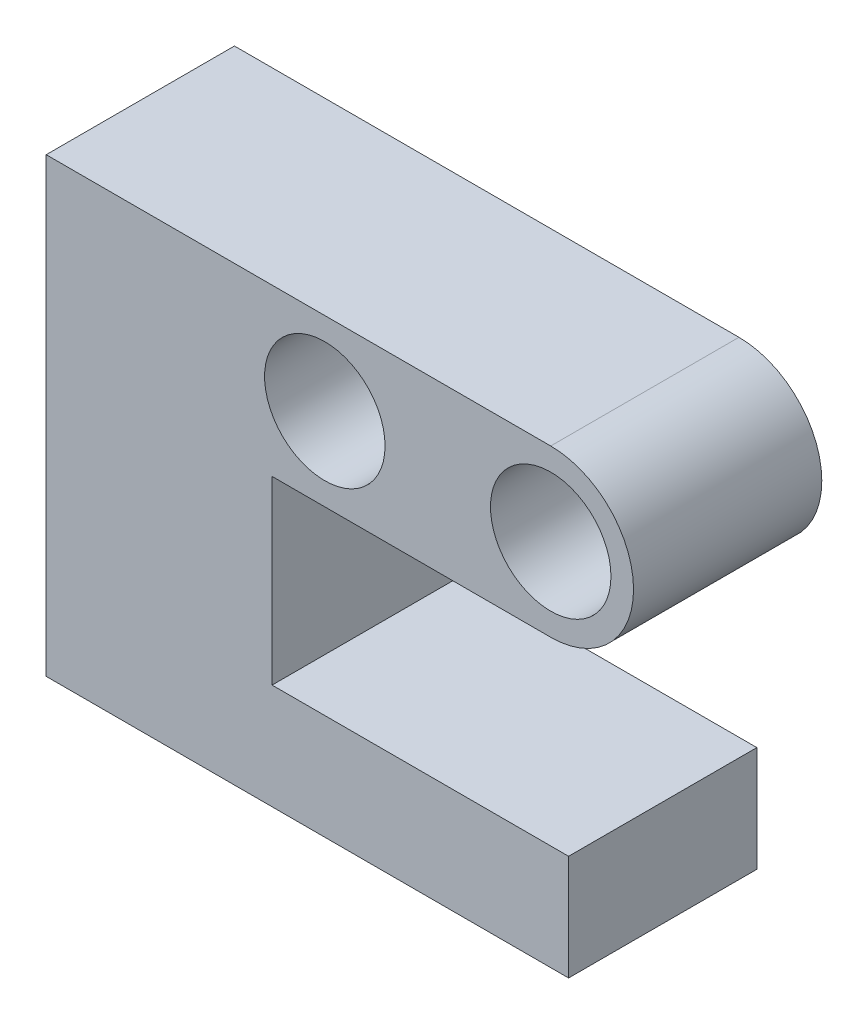
ISO-10303-21;
HEADER;
FILE_DESCRIPTION(('STEP AP214'),'2;1');
FILE_NAME('part.step','',(''),(''),'','','');
FILE_SCHEMA(('AUTOMOTIVE_DESIGN { 1 0 10303 214 1 1 1 1 }'));
ENDSEC;
DATA;
#1=APPLICATION_CONTEXT('core data for automotive mechanical design processes');
#2=APPLICATION_PROTOCOL_DEFINITION('international standard','automotive_design',2000,#1);
#3=PRODUCT_CONTEXT('',#1,'mechanical');
#4=PRODUCT('Part','Part','',(#3));
#5=PRODUCT_RELATED_PRODUCT_CATEGORY('part','',(#4));
#6=PRODUCT_DEFINITION_FORMATION('','',#4);
#7=PRODUCT_DEFINITION_CONTEXT('part definition',#1,'design');
#8=PRODUCT_DEFINITION('design','',#6,#7);
#9=PRODUCT_DEFINITION_SHAPE('','',#8);
#10=(LENGTH_UNIT() NAMED_UNIT(*) SI_UNIT(.MILLI.,.METRE.));
#11=(NAMED_UNIT(*) PLANE_ANGLE_UNIT() SI_UNIT($,.RADIAN.));
#12=(NAMED_UNIT(*) SI_UNIT($,.STERADIAN.) SOLID_ANGLE_UNIT());
#13=UNCERTAINTY_MEASURE_WITH_UNIT(LENGTH_MEASURE(1.E-05),#10,'distance_accuracy_value','');
#14=(GEOMETRIC_REPRESENTATION_CONTEXT(3) GLOBAL_UNCERTAINTY_ASSIGNED_CONTEXT((#13)) GLOBAL_UNIT_ASSIGNED_CONTEXT((#10,
#11,#12)) REPRESENTATION_CONTEXT('',''));
#15=CARTESIAN_POINT('',(0.,0.,0.));
#16=DIRECTION('',(0.,0.,1.));
#17=DIRECTION('',(1.,0.,0.));
#18=AXIS2_PLACEMENT_3D('',#15,#16,#17);
#19=CARTESIAN_POINT('',(0.,0.,25.));
#20=DIRECTION('',(0.,0.,1.));
#21=DIRECTION('',(1.,0.,0.));
#22=AXIS2_PLACEMENT_3D('',#19,#20,#21);
#23=PLANE('',#22);
#24=CARTESIAN_POINT('',(0.,0.,25.));
#25=DIRECTION('',(0.,0.,1.));
#26=DIRECTION('',(1.,0.,0.));
#27=AXIS2_PLACEMENT_3D('',#24,#25,#26);
#28=CIRCLE('',#27,8.);
#29=CARTESIAN_POINT('',(8.,0.,25.));
#30=VERTEX_POINT('',#29);
#31=EDGE_CURVE('E134',#30,#30,#28,.T.);
#32=ORIENTED_EDGE('',*,*,#31,.F.);
#33=EDGE_LOOP('',(#32));
#34=FACE_BOUND('',#33,.T.);
#35=DIRECTION('',(0.,-1.,0.));
#36=VECTOR('',#35,1.);
#37=CARTESIAN_POINT('',(-67.,11.,25.));
#38=LINE('',#37,#36);
#39=CARTESIAN_POINT('',(-67.,11.,25.));
#40=VERTEX_POINT('',#39);
#41=CARTESIAN_POINT('',(-67.,-49.,25.));
#42=VERTEX_POINT('',#41);
#43=EDGE_CURVE('E147',#40,#42,#38,.T.);
#44=ORIENTED_EDGE('',*,*,#43,.T.);
#45=DIRECTION('',(1.,0.,0.));
#46=VECTOR('',#45,1.);
#47=CARTESIAN_POINT('',(-67.,-49.,25.));
#48=LINE('',#47,#46);
#49=CARTESIAN_POINT('',(2.37423731385888,-49.,25.));
#50=VERTEX_POINT('',#49);
#51=EDGE_CURVE('E91',#42,#50,#48,.T.);
#52=ORIENTED_EDGE('',*,*,#51,.T.);
#53=DIRECTION('',(0.,1.,0.));
#54=VECTOR('',#53,1.);
#55=CARTESIAN_POINT('',(2.37423731385888,-49.,25.));
#56=LINE('',#55,#54);
#57=CARTESIAN_POINT('',(2.37423731385888,-35.,25.));
#58=VERTEX_POINT('',#57);
#59=EDGE_CURVE('E162',#50,#58,#56,.T.);
#60=ORIENTED_EDGE('',*,*,#59,.T.);
#61=DIRECTION('',(-1.,0.,0.));
#62=VECTOR('',#61,1.);
#63=CARTESIAN_POINT('',(2.37423731385888,-35.,25.));
#64=LINE('',#63,#62);
#65=CARTESIAN_POINT('',(-37.,-35.,25.));
#66=VERTEX_POINT('',#65);
#67=EDGE_CURVE('E173',#58,#66,#64,.T.);
#68=ORIENTED_EDGE('',*,*,#67,.T.);
#69=DIRECTION('',(0.,1.,0.));
#70=VECTOR('',#69,1.);
#71=CARTESIAN_POINT('',(-37.,-35.,25.));
#72=LINE('',#71,#70);
#73=CARTESIAN_POINT('',(-37.,-11.,25.));
#74=VERTEX_POINT('',#73);
#75=EDGE_CURVE('E111',#66,#74,#72,.T.);
#76=ORIENTED_EDGE('',*,*,#75,.T.);
#77=DIRECTION('',(1.,0.,0.));
#78=VECTOR('',#77,1.);
#79=CARTESIAN_POINT('',(-37.,-11.,25.));
#80=LINE('',#79,#78);
#81=CARTESIAN_POINT('',(0.,-11.,25.));
#82=VERTEX_POINT('',#81);
#83=EDGE_CURVE('E104',#74,#82,#80,.T.);
#84=ORIENTED_EDGE('',*,*,#83,.T.);
#85=CARTESIAN_POINT('',(0.,0.,25.));
#86=DIRECTION('',(0.,0.,1.));
#87=DIRECTION('',(1.,0.,0.));
#88=AXIS2_PLACEMENT_3D('',#85,#86,#87);
#89=CIRCLE('',#88,11.);
#90=CARTESIAN_POINT('',(0.,11.,25.));
#91=VERTEX_POINT('',#90);
#92=EDGE_CURVE('E108',#82,#91,#89,.T.);
#93=ORIENTED_EDGE('',*,*,#92,.T.);
#94=DIRECTION('',(-1.,0.,0.));
#95=VECTOR('',#94,1.);
#96=CARTESIAN_POINT('',(-30.,11.,25.));
#97=LINE('',#96,#95);
#98=EDGE_CURVE('E50',#91,#40,#97,.T.);
#99=ORIENTED_EDGE('',*,*,#98,.T.);
#100=EDGE_LOOP('',(#44,#52,#60,#68,#76,#84,#93,#99));
#101=FACE_BOUND('',#100,.T.);
#102=CARTESIAN_POINT('',(-30.,0.,25.));
#103=DIRECTION('',(0.,0.,1.));
#104=DIRECTION('',(1.,0.,0.));
#105=AXIS2_PLACEMENT_3D('',#102,#103,#104);
#106=CIRCLE('',#105,8.);
#107=CARTESIAN_POINT('',(-22.,0.,25.));
#108=VERTEX_POINT('',#107);
#109=EDGE_CURVE('E182',#108,#108,#106,.T.);
#110=ORIENTED_EDGE('',*,*,#109,.F.);
#111=EDGE_LOOP('',(#110));
#112=FACE_BOUND('',#111,.T.);
#113=ADVANCED_FACE('F33',(#34,#101,#112),#23,.T.);
#114=CARTESIAN_POINT('',(0.,0.,0.));
#115=DIRECTION('',(0.,0.,1.));
#116=DIRECTION('',(1.,0.,0.));
#117=AXIS2_PLACEMENT_3D('',#114,#115,#116);
#118=PLANE('',#117);
#119=DIRECTION('',(0.,-1.,0.));
#120=VECTOR('',#119,1.);
#121=CARTESIAN_POINT('',(-67.,11.,0.));
#122=LINE('',#121,#120);
#123=CARTESIAN_POINT('',(-67.,11.,0.));
#124=VERTEX_POINT('',#123);
#125=CARTESIAN_POINT('',(-67.,-49.,0.));
#126=VERTEX_POINT('',#125);
#127=EDGE_CURVE('E130',#124,#126,#122,.T.);
#128=ORIENTED_EDGE('',*,*,#127,.F.);
#129=DIRECTION('',(-1.,0.,0.));
#130=VECTOR('',#129,1.);
#131=CARTESIAN_POINT('',(-30.,11.,0.));
#132=LINE('',#131,#130);
#133=CARTESIAN_POINT('',(0.,11.,0.));
#134=VERTEX_POINT('',#133);
#135=EDGE_CURVE('E79',#134,#124,#132,.T.);
#136=ORIENTED_EDGE('',*,*,#135,.F.);
#137=CARTESIAN_POINT('',(0.,0.,0.));
#138=DIRECTION('',(0.,0.,1.));
#139=DIRECTION('',(1.,0.,0.));
#140=AXIS2_PLACEMENT_3D('',#137,#138,#139);
#141=CIRCLE('',#140,11.);
#142=CARTESIAN_POINT('',(0.,-11.,0.));
#143=VERTEX_POINT('',#142);
#144=EDGE_CURVE('E144',#143,#134,#141,.T.);
#145=ORIENTED_EDGE('',*,*,#144,.F.);
#146=DIRECTION('',(1.,0.,0.));
#147=VECTOR('',#146,1.);
#148=CARTESIAN_POINT('',(-30.,-11.,0.));
#149=LINE('',#148,#147);
#150=CARTESIAN_POINT('',(-37.,-11.,0.));
#151=VERTEX_POINT('',#150);
#152=EDGE_CURVE('E119',#151,#143,#149,.T.);
#153=ORIENTED_EDGE('',*,*,#152,.F.);
#154=DIRECTION('',(0.,1.,0.));
#155=VECTOR('',#154,1.);
#156=CARTESIAN_POINT('',(-37.,-35.,0.));
#157=LINE('',#156,#155);
#158=CARTESIAN_POINT('',(-37.,-35.,0.));
#159=VERTEX_POINT('',#158);
#160=EDGE_CURVE('E140',#159,#151,#157,.T.);
#161=ORIENTED_EDGE('',*,*,#160,.F.);
#162=DIRECTION('',(-1.,0.,0.));
#163=VECTOR('',#162,1.);
#164=CARTESIAN_POINT('',(2.37423731385888,-35.,0.));
#165=LINE('',#164,#163);
#166=CARTESIAN_POINT('',(2.37423731385888,-35.,0.));
#167=VERTEX_POINT('',#166);
#168=EDGE_CURVE('E138',#167,#159,#165,.T.);
#169=ORIENTED_EDGE('',*,*,#168,.F.);
#170=DIRECTION('',(0.,1.,0.));
#171=VECTOR('',#170,1.);
#172=CARTESIAN_POINT('',(2.37423731385888,-49.,0.));
#173=LINE('',#172,#171);
#174=CARTESIAN_POINT('',(2.37423731385888,-49.,0.));
#175=VERTEX_POINT('',#174);
#176=EDGE_CURVE('E136',#175,#167,#173,.T.);
#177=ORIENTED_EDGE('',*,*,#176,.F.);
#178=DIRECTION('',(1.,0.,0.));
#179=VECTOR('',#178,1.);
#180=CARTESIAN_POINT('',(-37.,-49.,0.));
#181=LINE('',#180,#179);
#182=EDGE_CURVE('E133',#126,#175,#181,.T.);
#183=ORIENTED_EDGE('',*,*,#182,.F.);
#184=EDGE_LOOP('',(#128,#136,#145,#153,#161,#169,#177,#183));
#185=FACE_BOUND('',#184,.T.);
#186=CARTESIAN_POINT('',(0.,0.,0.));
#187=DIRECTION('',(0.,0.,1.));
#188=DIRECTION('',(1.,0.,0.));
#189=AXIS2_PLACEMENT_3D('',#186,#187,#188);
#190=CIRCLE('',#189,8.);
#191=CARTESIAN_POINT('',(8.,0.,0.));
#192=VERTEX_POINT('',#191);
#193=EDGE_CURVE('E179',#192,#192,#190,.T.);
#194=ORIENTED_EDGE('',*,*,#193,.T.);
#195=EDGE_LOOP('',(#194));
#196=FACE_BOUND('',#195,.T.);
#197=CARTESIAN_POINT('',(-30.,0.,0.));
#198=DIRECTION('',(0.,0.,1.));
#199=DIRECTION('',(1.,0.,0.));
#200=AXIS2_PLACEMENT_3D('',#197,#198,#199);
#201=CIRCLE('',#200,8.);
#202=CARTESIAN_POINT('',(-22.,0.,0.));
#203=VERTEX_POINT('',#202);
#204=EDGE_CURVE('E185',#203,#203,#201,.T.);
#205=ORIENTED_EDGE('',*,*,#204,.T.);
#206=EDGE_LOOP('',(#205));
#207=FACE_BOUND('',#206,.T.);
#208=ADVANCED_FACE('F164',(#185,#196,#207),#118,.F.);
#209=CARTESIAN_POINT('',(-67.,11.,25.));
#210=DIRECTION('',(1.,0.,0.));
#211=DIRECTION('',(0.,0.,-1.));
#212=AXIS2_PLACEMENT_3D('',#209,#210,#211);
#213=PLANE('',#212);
#214=CARTESIAN_POINT('',(-67.,-39.,12.5));
#215=DIRECTION('',(-1.,0.,0.));
#216=DIRECTION('',(0.,-1.,0.));
#217=AXIS2_PLACEMENT_3D('',#214,#215,#216);
#218=CIRCLE('',#217,4.);
#219=CARTESIAN_POINT('',(-67.,-43.,12.5));
#220=VERTEX_POINT('',#219);
#221=EDGE_CURVE('E197',#220,#220,#218,.T.);
#222=ORIENTED_EDGE('',*,*,#221,.F.);
#223=EDGE_LOOP('',(#222));
#224=FACE_BOUND('',#223,.T.);
#225=CARTESIAN_POINT('',(-67.,1.,12.5));
#226=DIRECTION('',(-1.,0.,0.));
#227=DIRECTION('',(0.,-1.,0.));
#228=AXIS2_PLACEMENT_3D('',#225,#226,#227);
#229=CIRCLE('',#228,3.99999999999999);
#230=CARTESIAN_POINT('',(-67.,-2.99999999999999,12.5));
#231=VERTEX_POINT('',#230);
#232=EDGE_CURVE('E191',#231,#231,#229,.T.);
#233=ORIENTED_EDGE('',*,*,#232,.F.);
#234=EDGE_LOOP('',(#233));
#235=FACE_BOUND('',#234,.T.);
#236=ORIENTED_EDGE('',*,*,#127,.T.);
#237=DIRECTION('',(0.,0.,-1.));
#238=VECTOR('',#237,1.);
#239=CARTESIAN_POINT('',(-67.,-49.,25.));
#240=LINE('',#239,#238);
#241=EDGE_CURVE('E11',#42,#126,#240,.T.);
#242=ORIENTED_EDGE('',*,*,#241,.F.);
#243=ORIENTED_EDGE('',*,*,#43,.F.);
#244=DIRECTION('',(0.,0.,-1.));
#245=VECTOR('',#244,1.);
#246=CARTESIAN_POINT('',(-67.,11.,25.));
#247=LINE('',#246,#245);
#248=EDGE_CURVE('E126',#40,#124,#247,.T.);
#249=ORIENTED_EDGE('',*,*,#248,.T.);
#250=EDGE_LOOP('',(#236,#242,#243,#249));
#251=FACE_BOUND('',#250,.T.);
#252=ADVANCED_FACE('F35',(#224,#235,#251),#213,.F.);
#253=CARTESIAN_POINT('',(-37.,-49.,25.));
#254=DIRECTION('',(0.,1.,0.));
#255=DIRECTION('',(0.,0.,1.));
#256=AXIS2_PLACEMENT_3D('',#253,#254,#255);
#257=PLANE('',#256);
#258=ORIENTED_EDGE('',*,*,#182,.T.);
#259=DIRECTION('',(0.,0.,-1.));
#260=VECTOR('',#259,1.);
#261=CARTESIAN_POINT('',(2.37423731385888,-49.,25.));
#262=LINE('',#261,#260);
#263=EDGE_CURVE('E42',#50,#175,#262,.T.);
#264=ORIENTED_EDGE('',*,*,#263,.F.);
#265=ORIENTED_EDGE('',*,*,#51,.F.);
#266=ORIENTED_EDGE('',*,*,#241,.T.);
#267=EDGE_LOOP('',(#258,#264,#265,#266));
#268=FACE_BOUND('',#267,.T.);
#269=ADVANCED_FACE('F214',(#268),#257,.F.);
#270=CARTESIAN_POINT('',(2.37423731385888,-49.,25.));
#271=DIRECTION('',(-1.,0.,0.));
#272=DIRECTION('',(0.,0.,1.));
#273=AXIS2_PLACEMENT_3D('',#270,#271,#272);
#274=PLANE('',#273);
#275=ORIENTED_EDGE('',*,*,#176,.T.);
#276=DIRECTION('',(0.,0.,-1.));
#277=VECTOR('',#276,1.);
#278=CARTESIAN_POINT('',(2.37423731385888,-35.,25.));
#279=LINE('',#278,#277);
#280=EDGE_CURVE('E154',#58,#167,#279,.T.);
#281=ORIENTED_EDGE('',*,*,#280,.F.);
#282=ORIENTED_EDGE('',*,*,#59,.F.);
#283=ORIENTED_EDGE('',*,*,#263,.T.);
#284=EDGE_LOOP('',(#275,#281,#282,#283));
#285=FACE_BOUND('',#284,.T.);
#286=ADVANCED_FACE('F160',(#285),#274,.F.);
#287=CARTESIAN_POINT('',(2.37423731385888,-35.,25.));
#288=DIRECTION('',(0.,-1.,0.));
#289=DIRECTION('',(1.,0.,0.));
#290=AXIS2_PLACEMENT_3D('',#287,#288,#289);
#291=PLANE('',#290);
#292=ORIENTED_EDGE('',*,*,#168,.T.);
#293=DIRECTION('',(0.,0.,-1.));
#294=VECTOR('',#293,1.);
#295=CARTESIAN_POINT('',(-37.,-35.,25.));
#296=LINE('',#295,#294);
#297=EDGE_CURVE('E151',#66,#159,#296,.T.);
#298=ORIENTED_EDGE('',*,*,#297,.F.);
#299=ORIENTED_EDGE('',*,*,#67,.F.);
#300=ORIENTED_EDGE('',*,*,#280,.T.);
#301=EDGE_LOOP('',(#292,#298,#299,#300));
#302=FACE_BOUND('',#301,.T.);
#303=ADVANCED_FACE('F169',(#302),#291,.F.);
#304=CARTESIAN_POINT('',(-37.,-35.,25.));
#305=DIRECTION('',(-1.,0.,0.));
#306=DIRECTION('',(0.,0.,1.));
#307=AXIS2_PLACEMENT_3D('',#304,#305,#306);
#308=PLANE('',#307);
#309=ORIENTED_EDGE('',*,*,#160,.T.);
#310=DIRECTION('',(0.,0.,-1.));
#311=VECTOR('',#310,1.);
#312=CARTESIAN_POINT('',(-37.,-11.,25.));
#313=LINE('',#312,#311);
#314=EDGE_CURVE('E121',#74,#151,#313,.T.);
#315=ORIENTED_EDGE('',*,*,#314,.F.);
#316=ORIENTED_EDGE('',*,*,#75,.F.);
#317=ORIENTED_EDGE('',*,*,#297,.T.);
#318=EDGE_LOOP('',(#309,#315,#316,#317));
#319=FACE_BOUND('',#318,.T.);
#320=ADVANCED_FACE('F172',(#319),#308,.F.);
#321=CARTESIAN_POINT('',(-30.,-11.,25.));
#322=DIRECTION('',(0.,1.,0.));
#323=DIRECTION('',(-1.,0.,0.));
#324=AXIS2_PLACEMENT_3D('',#321,#322,#323);
#325=PLANE('',#324);
#326=ORIENTED_EDGE('',*,*,#152,.T.);
#327=DIRECTION('',(0.,0.,-1.));
#328=VECTOR('',#327,1.);
#329=CARTESIAN_POINT('',(0.,-11.,25.));
#330=LINE('',#329,#328);
#331=EDGE_CURVE('E117',#82,#143,#330,.T.);
#332=ORIENTED_EDGE('',*,*,#331,.F.);
#333=ORIENTED_EDGE('',*,*,#83,.F.);
#334=ORIENTED_EDGE('',*,*,#314,.T.);
#335=EDGE_LOOP('',(#326,#332,#333,#334));
#336=FACE_BOUND('',#335,.T.);
#337=ADVANCED_FACE('F118',(#336),#325,.F.);
#338=CARTESIAN_POINT('',(0.,0.,25.));
#339=DIRECTION('',(0.,0.,-1.));
#340=DIRECTION('',(-1.,0.,0.));
#341=AXIS2_PLACEMENT_3D('',#338,#339,#340);
#342=CYLINDRICAL_SURFACE('',#341,11.);
#343=ORIENTED_EDGE('',*,*,#144,.T.);
#344=DIRECTION('',(0.,0.,-1.));
#345=VECTOR('',#344,1.);
#346=CARTESIAN_POINT('',(0.,11.,25.));
#347=LINE('',#346,#345);
#348=EDGE_CURVE('E122',#91,#134,#347,.T.);
#349=ORIENTED_EDGE('',*,*,#348,.F.);
#350=ORIENTED_EDGE('',*,*,#92,.F.);
#351=ORIENTED_EDGE('',*,*,#331,.T.);
#352=EDGE_LOOP('',(#343,#349,#350,#351));
#353=FACE_BOUND('',#352,.T.);
#354=ADVANCED_FACE('F124',(#353),#342,.T.);
#355=CARTESIAN_POINT('',(-30.,11.,25.));
#356=DIRECTION('',(0.,-1.,0.));
#357=DIRECTION('',(1.,0.,0.));
#358=AXIS2_PLACEMENT_3D('',#355,#356,#357);
#359=PLANE('',#358);
#360=ORIENTED_EDGE('',*,*,#135,.T.);
#361=ORIENTED_EDGE('',*,*,#248,.F.);
#362=ORIENTED_EDGE('',*,*,#98,.F.);
#363=ORIENTED_EDGE('',*,*,#348,.T.);
#364=EDGE_LOOP('',(#360,#361,#362,#363));
#365=FACE_BOUND('',#364,.T.);
#366=ADVANCED_FACE('F219',(#365),#359,.F.);
#367=CARTESIAN_POINT('',(0.,0.,25.));
#368=DIRECTION('',(0.,0.,-1.));
#369=DIRECTION('',(-1.,0.,0.));
#370=AXIS2_PLACEMENT_3D('',#367,#368,#369);
#371=CYLINDRICAL_SURFACE('',#370,8.);
#372=ORIENTED_EDGE('',*,*,#31,.T.);
#373=EDGE_LOOP('',(#372));
#374=FACE_BOUND('',#373,.T.);
#375=ORIENTED_EDGE('',*,*,#193,.F.);
#376=EDGE_LOOP('',(#375));
#377=FACE_BOUND('',#376,.T.);
#378=ADVANCED_FACE('F221',(#374,#377),#371,.F.);
#379=CARTESIAN_POINT('',(-30.,0.,25.));
#380=DIRECTION('',(0.,0.,-1.));
#381=DIRECTION('',(-1.,0.,0.));
#382=AXIS2_PLACEMENT_3D('',#379,#380,#381);
#383=CYLINDRICAL_SURFACE('',#382,8.);
#384=ORIENTED_EDGE('',*,*,#109,.T.);
#385=EDGE_LOOP('',(#384));
#386=FACE_BOUND('',#385,.T.);
#387=ORIENTED_EDGE('',*,*,#204,.F.);
#388=EDGE_LOOP('',(#387));
#389=FACE_BOUND('',#388,.T.);
#390=ADVANCED_FACE('F227',(#386,#389),#383,.F.);
#391=CARTESIAN_POINT('',(-50.,1.00000000000001,12.5));
#392=DIRECTION('',(-1.,0.,0.));
#393=DIRECTION('',(0.,-1.,0.));
#394=AXIS2_PLACEMENT_3D('',#391,#392,#393);
#395=CYLINDRICAL_SURFACE('',#394,3.99999999999999);
#396=CARTESIAN_POINT('',(-50.,1.00000000000001,12.5));
#397=DIRECTION('',(-1.,0.,0.));
#398=DIRECTION('',(0.,-1.,0.));
#399=AXIS2_PLACEMENT_3D('',#396,#397,#398);
#400=CIRCLE('',#399,3.99999999999999);
#401=CARTESIAN_POINT('',(-50.,-2.99999999999999,12.5));
#402=VERTEX_POINT('',#401);
#403=EDGE_CURVE('E188',#402,#402,#400,.T.);
#404=ORIENTED_EDGE('',*,*,#403,.F.);
#405=EDGE_LOOP('',(#404));
#406=FACE_BOUND('',#405,.T.);
#407=ORIENTED_EDGE('',*,*,#232,.T.);
#408=EDGE_LOOP('',(#407));
#409=FACE_BOUND('',#408,.T.);
#410=ADVANCED_FACE('F242',(#406,#409),#395,.F.);
#411=CARTESIAN_POINT('',(-50.,1.00000000000001,12.5));
#412=DIRECTION('',(-1.,0.,0.));
#413=DIRECTION('',(0.,-1.,0.));
#414=AXIS2_PLACEMENT_3D('',#411,#412,#413);
#415=PLANE('',#414);
#416=ORIENTED_EDGE('',*,*,#403,.T.);
#417=EDGE_LOOP('',(#416));
#418=FACE_BOUND('',#417,.T.);
#419=ADVANCED_FACE('F208',(#418),#415,.T.);
#420=CARTESIAN_POINT('',(-50.,-39.,12.5));
#421=DIRECTION('',(-1.,0.,0.));
#422=DIRECTION('',(0.,-1.,0.));
#423=AXIS2_PLACEMENT_3D('',#420,#421,#422);
#424=CYLINDRICAL_SURFACE('',#423,4.);
#425=CARTESIAN_POINT('',(-50.,-39.,12.5));
#426=DIRECTION('',(-1.,0.,0.));
#427=DIRECTION('',(0.,-1.,0.));
#428=AXIS2_PLACEMENT_3D('',#425,#426,#427);
#429=CIRCLE('',#428,4.);
#430=CARTESIAN_POINT('',(-50.,-43.,12.5));
#431=VERTEX_POINT('',#430);
#432=EDGE_CURVE('E194',#431,#431,#429,.T.);
#433=ORIENTED_EDGE('',*,*,#432,.F.);
#434=EDGE_LOOP('',(#433));
#435=FACE_BOUND('',#434,.T.);
#436=ORIENTED_EDGE('',*,*,#221,.T.);
#437=EDGE_LOOP('',(#436));
#438=FACE_BOUND('',#437,.T.);
#439=ADVANCED_FACE('F205',(#435,#438),#424,.F.);
#440=CARTESIAN_POINT('',(-50.,-39.,12.5));
#441=DIRECTION('',(-1.,0.,0.));
#442=DIRECTION('',(0.,-1.,0.));
#443=AXIS2_PLACEMENT_3D('',#440,#441,#442);
#444=PLANE('',#443);
#445=ORIENTED_EDGE('',*,*,#432,.T.);
#446=EDGE_LOOP('',(#445));
#447=FACE_BOUND('',#446,.T.);
#448=ADVANCED_FACE('F203',(#447),#444,.T.);
#449=CLOSED_SHELL('',(#113,#208,#252,#269,#286,#303,#320,#337,#354,#366,#378,#390,#410,#419,
#439,#448));
#450=MANIFOLD_SOLID_BREP('B2',#449);
#451=ADVANCED_BREP_SHAPE_REPRESENTATION('',(#18,#450),#14);
#452=SHAPE_DEFINITION_REPRESENTATION(#9,#451);
ENDSEC;
END-ISO-10303-21;
